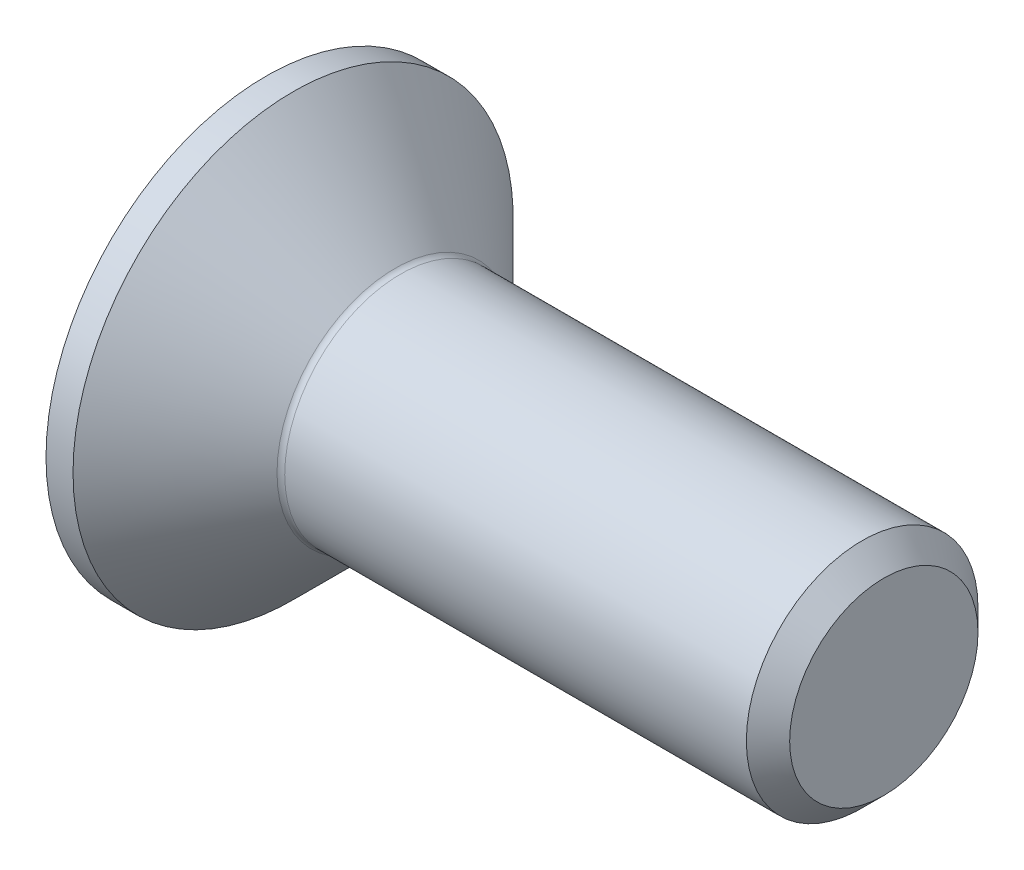
ISO-10303-21;
HEADER;
FILE_DESCRIPTION(('STEP AP214'),'2;1');
FILE_NAME('part.step','',(''),(''),'','','');
FILE_SCHEMA(('AUTOMOTIVE_DESIGN { 1 0 10303 214 1 1 1 1 }'));
ENDSEC;
DATA;
#1=APPLICATION_CONTEXT('core data for automotive mechanical design processes');
#2=APPLICATION_PROTOCOL_DEFINITION('international standard','automotive_design',2000,#1);
#3=PRODUCT_CONTEXT('',#1,'mechanical');
#4=PRODUCT('Part','Part','',(#3));
#5=PRODUCT_RELATED_PRODUCT_CATEGORY('part','',(#4));
#6=PRODUCT_DEFINITION_FORMATION('','',#4);
#7=PRODUCT_DEFINITION_CONTEXT('part definition',#1,'design');
#8=PRODUCT_DEFINITION('design','',#6,#7);
#9=PRODUCT_DEFINITION_SHAPE('','',#8);
#10=(LENGTH_UNIT() NAMED_UNIT(*) SI_UNIT(.MILLI.,.METRE.));
#11=(NAMED_UNIT(*) PLANE_ANGLE_UNIT() SI_UNIT($,.RADIAN.));
#12=(NAMED_UNIT(*) SI_UNIT($,.STERADIAN.) SOLID_ANGLE_UNIT());
#13=UNCERTAINTY_MEASURE_WITH_UNIT(LENGTH_MEASURE(1.E-05),#10,'distance_accuracy_value','');
#14=(GEOMETRIC_REPRESENTATION_CONTEXT(3) GLOBAL_UNCERTAINTY_ASSIGNED_CONTEXT((#13)) GLOBAL_UNIT_ASSIGNED_CONTEXT((#10,
#11,#12)) REPRESENTATION_CONTEXT('',''));
#15=CARTESIAN_POINT('',(0.,0.,0.));
#16=DIRECTION('',(0.,0.,1.));
#17=DIRECTION('',(1.,0.,0.));
#18=AXIS2_PLACEMENT_3D('',#15,#16,#17);
#19=CARTESIAN_POINT('',(0.,0.,0.));
#20=DIRECTION('',(-1.,0.,0.));
#21=DIRECTION('',(0.,0.,1.));
#22=AXIS2_PLACEMENT_3D('',#19,#20,#21);
#23=PLANE('',#22);
#24=CARTESIAN_POINT('',(0.,0.,0.));
#25=DIRECTION('',(-1.,0.,0.));
#26=DIRECTION('',(0.,0.,1.));
#27=AXIS2_PLACEMENT_3D('',#24,#25,#26);
#28=CIRCLE('',#27,2.85);
#29=CARTESIAN_POINT('',(0.,0.,2.85));
#30=VERTEX_POINT('',#29);
#31=EDGE_CURVE('E153',#30,#30,#28,.T.);
#32=ORIENTED_EDGE('',*,*,#31,.T.);
#33=EDGE_LOOP('',(#32));
#34=FACE_BOUND('',#33,.T.);
#35=DIRECTION('',(0.,-0.500000000000005,-0.866025403784435));
#36=VECTOR('',#35,1.);
#37=CARTESIAN_POINT('',(0.,-0.58312377188152,1.01));
#38=LINE('',#37,#36);
#39=CARTESIAN_POINT('',(0.,-0.58312377188152,1.01));
#40=VERTEX_POINT('',#39);
#41=CARTESIAN_POINT('',(0.,-1.16624754376305,0.));
#42=VERTEX_POINT('',#41);
#43=EDGE_CURVE('E115',#40,#42,#38,.T.);
#44=ORIENTED_EDGE('',*,*,#43,.T.);
#45=DIRECTION('',(0.,0.500000000000005,-0.866025403784436));
#46=VECTOR('',#45,1.);
#47=CARTESIAN_POINT('',(0.,-1.16624754376305,0.));
#48=LINE('',#47,#46);
#49=CARTESIAN_POINT('',(0.,-0.583123771881521,-1.01));
#50=VERTEX_POINT('',#49);
#51=EDGE_CURVE('E45',#42,#50,#48,.T.);
#52=ORIENTED_EDGE('',*,*,#51,.T.);
#53=DIRECTION('',(0.,1.,0.));
#54=VECTOR('',#53,1.);
#55=CARTESIAN_POINT('',(0.,-0.583123771881521,-1.01));
#56=LINE('',#55,#54);
#57=CARTESIAN_POINT('',(0.,0.583123771881522,-1.01));
#58=VERTEX_POINT('',#57);
#59=EDGE_CURVE('E130',#50,#58,#56,.T.);
#60=ORIENTED_EDGE('',*,*,#59,.T.);
#61=DIRECTION('',(0.,0.500000000000003,0.866025403784437));
#62=VECTOR('',#61,1.);
#63=CARTESIAN_POINT('',(0.,0.583123771881522,-1.01));
#64=LINE('',#63,#62);
#65=CARTESIAN_POINT('',(0.,1.16624754376305,0.));
#66=VERTEX_POINT('',#65);
#67=EDGE_CURVE('E266',#58,#66,#64,.T.);
#68=ORIENTED_EDGE('',*,*,#67,.T.);
#69=DIRECTION('',(0.,-0.500000000000001,0.866025403784438));
#70=VECTOR('',#69,1.);
#71=CARTESIAN_POINT('',(0.,1.16624754376305,0.));
#72=LINE('',#71,#70);
#73=CARTESIAN_POINT('',(0.,0.583123771881523,1.01));
#74=VERTEX_POINT('',#73);
#75=EDGE_CURVE('E269',#66,#74,#72,.T.);
#76=ORIENTED_EDGE('',*,*,#75,.T.);
#77=DIRECTION('',(0.,-1.,0.));
#78=VECTOR('',#77,1.);
#79=CARTESIAN_POINT('',(0.,0.583123771881523,1.01));
#80=LINE('',#79,#78);
#81=EDGE_CURVE('E272',#74,#40,#80,.T.);
#82=ORIENTED_EDGE('',*,*,#81,.T.);
#83=EDGE_LOOP('',(#44,#52,#60,#68,#76,#82));
#84=FACE_BOUND('',#83,.T.);
#85=ADVANCED_FACE('F30',(#34,#84),#23,.T.);
#86=CARTESIAN_POINT('',(0.,0.,0.));
#87=DIRECTION('',(-1.,0.,0.));
#88=DIRECTION('',(0.,0.,1.));
#89=AXIS2_PLACEMENT_3D('',#86,#87,#88);
#90=CYLINDRICAL_SURFACE('',#89,2.85);
#91=CARTESIAN_POINT('',(0.350000000000014,0.,0.));
#92=DIRECTION('',(-1.,0.,0.));
#93=DIRECTION('',(0.,0.,1.));
#94=AXIS2_PLACEMENT_3D('',#91,#92,#93);
#95=CIRCLE('',#94,2.85);
#96=CARTESIAN_POINT('',(0.350000000000014,0.,2.85));
#97=VERTEX_POINT('',#96);
#98=EDGE_CURVE('E150',#97,#97,#95,.T.);
#99=ORIENTED_EDGE('',*,*,#98,.T.);
#100=EDGE_LOOP('',(#99));
#101=FACE_BOUND('',#100,.T.);
#102=ORIENTED_EDGE('',*,*,#31,.F.);
#103=EDGE_LOOP('',(#102));
#104=FACE_BOUND('',#103,.T.);
#105=ADVANCED_FACE('F174',(#101,#104),#90,.T.);
#106=CARTESIAN_POINT('',(0.350000000000014,0.,0.));
#107=DIRECTION('',(-1.,0.,0.));
#108=DIRECTION('',(0.,0.,1.));
#109=AXIS2_PLACEMENT_3D('',#106,#107,#108);
#110=CONICAL_SURFACE('',#109,2.85,0.785398163397452);
#111=CARTESIAN_POINT('',(1.67071067811867,0.,0.));
#112=DIRECTION('',(-1.,0.,0.));
#113=DIRECTION('',(0.,0.,1.));
#114=AXIS2_PLACEMENT_3D('',#111,#112,#113);
#115=CIRCLE('',#114,1.52928932188134);
#116=CARTESIAN_POINT('',(1.67071067811867,0.,1.52928932188134));
#117=VERTEX_POINT('',#116);
#118=EDGE_CURVE('E38',#117,#117,#115,.T.);
#119=ORIENTED_EDGE('',*,*,#118,.T.);
#120=EDGE_LOOP('',(#119));
#121=FACE_BOUND('',#120,.T.);
#122=ORIENTED_EDGE('',*,*,#98,.F.);
#123=EDGE_LOOP('',(#122));
#124=FACE_BOUND('',#123,.T.);
#125=ADVANCED_FACE('F158',(#121,#124),#110,.T.);
#126=CARTESIAN_POINT('',(0.,0.,0.));
#127=DIRECTION('',(-1.,0.,0.));
#128=DIRECTION('',(0.,0.,1.));
#129=AXIS2_PLACEMENT_3D('',#126,#127,#128);
#130=CYLINDRICAL_SURFACE('',#129,1.49999999999999);
#131=CARTESIAN_POINT('',(1.74142135623732,0.,0.));
#132=DIRECTION('',(-1.,0.,0.));
#133=DIRECTION('',(0.,0.,1.));
#134=AXIS2_PLACEMENT_3D('',#131,#132,#133);
#135=CIRCLE('',#134,1.49999999999999);
#136=CARTESIAN_POINT('',(1.74142135623732,0.,1.49999999999999));
#137=VERTEX_POINT('',#136);
#138=EDGE_CURVE('E11',#137,#137,#135,.F.);
#139=ORIENTED_EDGE('',*,*,#138,.T.);
#140=EDGE_LOOP('',(#139));
#141=FACE_BOUND('',#140,.T.);
#142=CARTESIAN_POINT('',(7.71949999999998,0.,0.));
#143=DIRECTION('',(-1.,0.,0.));
#144=DIRECTION('',(0.,0.,1.));
#145=AXIS2_PLACEMENT_3D('',#142,#143,#144);
#146=CIRCLE('',#145,1.49999999999998);
#147=CARTESIAN_POINT('',(7.71949999999998,0.,1.49999999999998));
#148=VERTEX_POINT('',#147);
#149=EDGE_CURVE('E147',#148,#148,#146,.T.);
#150=ORIENTED_EDGE('',*,*,#149,.T.);
#151=EDGE_LOOP('',(#150));
#152=FACE_BOUND('',#151,.T.);
#153=ADVANCED_FACE('F185',(#141,#152),#130,.T.);
#154=CARTESIAN_POINT('',(8.,0.,0.));
#155=DIRECTION('',(-1.,0.,0.));
#156=DIRECTION('',(0.,0.,1.));
#157=AXIS2_PLACEMENT_3D('',#154,#155,#156);
#158=CONICAL_SURFACE('',#157,1.2195,0.785398163397371);
#159=ORIENTED_EDGE('',*,*,#149,.F.);
#160=EDGE_LOOP('',(#159));
#161=FACE_BOUND('',#160,.T.);
#162=CARTESIAN_POINT('',(8.,0.,0.));
#163=DIRECTION('',(-1.,0.,0.));
#164=DIRECTION('',(0.,0.,1.));
#165=AXIS2_PLACEMENT_3D('',#162,#163,#164);
#166=CIRCLE('',#165,1.2195);
#167=CARTESIAN_POINT('',(8.,0.,1.2195));
#168=VERTEX_POINT('',#167);
#169=EDGE_CURVE('E143',#168,#168,#166,.T.);
#170=ORIENTED_EDGE('',*,*,#169,.T.);
#171=EDGE_LOOP('',(#170));
#172=FACE_BOUND('',#171,.T.);
#173=ADVANCED_FACE('F169',(#161,#172),#158,.T.);
#174=CARTESIAN_POINT('',(8.,1.2195,0.));
#175=DIRECTION('',(1.,0.,0.));
#176=DIRECTION('',(0.,0.,-1.));
#177=AXIS2_PLACEMENT_3D('',#174,#175,#176);
#178=PLANE('',#177);
#179=ORIENTED_EDGE('',*,*,#169,.F.);
#180=EDGE_LOOP('',(#179));
#181=FACE_BOUND('',#180,.T.);
#182=ADVANCED_FACE('F162',(#181),#178,.T.);
#183=CARTESIAN_POINT('',(1.74142135623732,0.,0.));
#184=DIRECTION('',(-1.,0.,0.));
#185=DIRECTION('',(0.,0.,1.));
#186=AXIS2_PLACEMENT_3D('',#183,#184,#185);
#187=TOROIDAL_SURFACE('',#186,1.59999999999999,0.1);
#188=ORIENTED_EDGE('',*,*,#138,.F.);
#189=EDGE_LOOP('',(#188));
#190=FACE_BOUND('',#189,.T.);
#191=ORIENTED_EDGE('',*,*,#118,.F.);
#192=EDGE_LOOP('',(#191));
#193=FACE_BOUND('',#192,.T.);
#194=ADVANCED_FACE('F32',(#190,#193),#187,.F.);
#195=CARTESIAN_POINT('',(1.2,-1.16624754376305,0.));
#196=DIRECTION('',(0.,0.866025403784436,0.500000000000005));
#197=DIRECTION('',(0.,-0.500000000000005,0.866025403784436));
#198=AXIS2_PLACEMENT_3D('',#195,#196,#197);
#199=PLANE('',#198);
#200=ORIENTED_EDGE('',*,*,#51,.F.);
#201=DIRECTION('',(-1.,0.,0.));
#202=VECTOR('',#201,1.);
#203=CARTESIAN_POINT('',(1.2,-1.16624754376305,0.));
#204=LINE('',#203,#202);
#205=CARTESIAN_POINT('',(1.2,-1.16624754376305,0.));
#206=VERTEX_POINT('',#205);
#207=EDGE_CURVE('E263',#206,#42,#204,.T.);
#208=ORIENTED_EDGE('',*,*,#207,.F.);
#209=DIRECTION('',(0.,0.500000000000005,-0.866025403784436));
#210=VECTOR('',#209,1.);
#211=CARTESIAN_POINT('',(1.2,-1.16624754376305,0.));
#212=LINE('',#211,#210);
#213=CARTESIAN_POINT('',(1.2,-0.874685657822283,-0.505000000000006));
#214=VERTEX_POINT('',#213);
#215=EDGE_CURVE('E112',#206,#214,#212,.T.);
#216=ORIENTED_EDGE('',*,*,#215,.T.);
#217=CARTESIAN_POINT('',(1.2,-0.583123771881521,-1.01));
#218=VERTEX_POINT('',#217);
#219=EDGE_CURVE('E106',#214,#218,#212,.T.);
#220=ORIENTED_EDGE('',*,*,#219,.T.);
#221=DIRECTION('',(-1.,0.,0.));
#222=VECTOR('',#221,1.);
#223=CARTESIAN_POINT('',(1.2,-0.583123771881521,-1.01));
#224=LINE('',#223,#222);
#225=EDGE_CURVE('E110',#218,#50,#224,.T.);
#226=ORIENTED_EDGE('',*,*,#225,.T.);
#227=EDGE_LOOP('',(#200,#208,#216,#220,#226));
#228=FACE_BOUND('',#227,.T.);
#229=ADVANCED_FACE('F108',(#228),#199,.T.);
#230=CARTESIAN_POINT('',(1.2,-0.583123771881521,-1.01));
#231=DIRECTION('',(0.,0.,1.));
#232=DIRECTION('',(0.,-1.,0.));
#233=AXIS2_PLACEMENT_3D('',#230,#231,#232);
#234=PLANE('',#233);
#235=ORIENTED_EDGE('',*,*,#59,.F.);
#236=ORIENTED_EDGE('',*,*,#225,.F.);
#237=DIRECTION('',(0.,1.,0.));
#238=VECTOR('',#237,1.);
#239=CARTESIAN_POINT('',(1.2,-0.583123771881521,-1.01));
#240=LINE('',#239,#238);
#241=CARTESIAN_POINT('',(1.2,0.,-1.01));
#242=VERTEX_POINT('',#241);
#243=EDGE_CURVE('E118',#218,#242,#240,.T.);
#244=ORIENTED_EDGE('',*,*,#243,.T.);
#245=CARTESIAN_POINT('',(1.2,0.583123771881522,-1.01));
#246=VERTEX_POINT('',#245);
#247=EDGE_CURVE('E125',#242,#246,#240,.T.);
#248=ORIENTED_EDGE('',*,*,#247,.T.);
#249=DIRECTION('',(-1.,0.,0.));
#250=VECTOR('',#249,1.);
#251=CARTESIAN_POINT('',(1.2,0.583123771881522,-1.01));
#252=LINE('',#251,#250);
#253=EDGE_CURVE('E132',#246,#58,#252,.T.);
#254=ORIENTED_EDGE('',*,*,#253,.T.);
#255=EDGE_LOOP('',(#235,#236,#244,#248,#254));
#256=FACE_BOUND('',#255,.T.);
#257=ADVANCED_FACE('F127',(#256),#234,.T.);
#258=CARTESIAN_POINT('',(1.2,0.583123771881522,-1.01));
#259=DIRECTION('',(0.,-0.866025403784437,0.500000000000003));
#260=DIRECTION('',(0.,-0.500000000000003,-0.866025403784437));
#261=AXIS2_PLACEMENT_3D('',#258,#259,#260);
#262=PLANE('',#261);
#263=ORIENTED_EDGE('',*,*,#67,.F.);
#264=ORIENTED_EDGE('',*,*,#253,.F.);
#265=DIRECTION('',(0.,0.500000000000003,0.866025403784437));
#266=VECTOR('',#265,1.);
#267=CARTESIAN_POINT('',(1.2,0.583123771881522,-1.01));
#268=LINE('',#267,#266);
#269=CARTESIAN_POINT('',(1.2,0.874685657822282,-0.505000000000003));
#270=VERTEX_POINT('',#269);
#271=EDGE_CURVE('E255',#246,#270,#268,.T.);
#272=ORIENTED_EDGE('',*,*,#271,.T.);
#273=CARTESIAN_POINT('',(1.2,1.16624754376305,0.));
#274=VERTEX_POINT('',#273);
#275=EDGE_CURVE('E124',#270,#274,#268,.T.);
#276=ORIENTED_EDGE('',*,*,#275,.T.);
#277=DIRECTION('',(-1.,0.,0.));
#278=VECTOR('',#277,1.);
#279=CARTESIAN_POINT('',(1.2,1.16624754376305,0.));
#280=LINE('',#279,#278);
#281=EDGE_CURVE('E138',#274,#66,#280,.T.);
#282=ORIENTED_EDGE('',*,*,#281,.T.);
#283=EDGE_LOOP('',(#263,#264,#272,#276,#282));
#284=FACE_BOUND('',#283,.T.);
#285=ADVANCED_FACE('F199',(#284),#262,.T.);
#286=CARTESIAN_POINT('',(1.2,1.16624754376305,0.));
#287=DIRECTION('',(0.,-0.866025403784438,-0.500000000000001));
#288=DIRECTION('',(0.,0.500000000000001,-0.866025403784438));
#289=AXIS2_PLACEMENT_3D('',#286,#287,#288);
#290=PLANE('',#289);
#291=ORIENTED_EDGE('',*,*,#75,.F.);
#292=ORIENTED_EDGE('',*,*,#281,.F.);
#293=DIRECTION('',(0.,-0.500000000000001,0.866025403784438));
#294=VECTOR('',#293,1.);
#295=CARTESIAN_POINT('',(1.2,1.16624754376305,0.));
#296=LINE('',#295,#294);
#297=CARTESIAN_POINT('',(1.2,0.874685657822283,0.505000000000001));
#298=VERTEX_POINT('',#297);
#299=EDGE_CURVE('E53',#274,#298,#296,.T.);
#300=ORIENTED_EDGE('',*,*,#299,.T.);
#301=CARTESIAN_POINT('',(1.2,0.583123771881523,1.01));
#302=VERTEX_POINT('',#301);
#303=EDGE_CURVE('E234',#298,#302,#296,.T.);
#304=ORIENTED_EDGE('',*,*,#303,.T.);
#305=DIRECTION('',(-1.,0.,0.));
#306=VECTOR('',#305,1.);
#307=CARTESIAN_POINT('',(1.2,0.583123771881523,1.01));
#308=LINE('',#307,#306);
#309=EDGE_CURVE('E248',#302,#74,#308,.T.);
#310=ORIENTED_EDGE('',*,*,#309,.T.);
#311=EDGE_LOOP('',(#291,#292,#300,#304,#310));
#312=FACE_BOUND('',#311,.T.);
#313=ADVANCED_FACE('F202',(#312),#290,.T.);
#314=CARTESIAN_POINT('',(1.2,0.583123771881523,1.01));
#315=DIRECTION('',(0.,0.,-1.));
#316=DIRECTION('',(0.,1.,0.));
#317=AXIS2_PLACEMENT_3D('',#314,#315,#316);
#318=PLANE('',#317);
#319=ORIENTED_EDGE('',*,*,#81,.F.);
#320=ORIENTED_EDGE('',*,*,#309,.F.);
#321=DIRECTION('',(0.,-1.,0.));
#322=VECTOR('',#321,1.);
#323=CARTESIAN_POINT('',(1.2,0.583123771881523,1.01));
#324=LINE('',#323,#322);
#325=CARTESIAN_POINT('',(1.2,0.,1.01));
#326=VERTEX_POINT('',#325);
#327=EDGE_CURVE('E233',#302,#326,#324,.T.);
#328=ORIENTED_EDGE('',*,*,#327,.T.);
#329=CARTESIAN_POINT('',(1.2,-0.58312377188152,1.01));
#330=VERTEX_POINT('',#329);
#331=EDGE_CURVE('E239',#326,#330,#324,.T.);
#332=ORIENTED_EDGE('',*,*,#331,.T.);
#333=DIRECTION('',(-1.,0.,0.));
#334=VECTOR('',#333,1.);
#335=CARTESIAN_POINT('',(1.2,-0.58312377188152,1.01));
#336=LINE('',#335,#334);
#337=EDGE_CURVE('E278',#330,#40,#336,.T.);
#338=ORIENTED_EDGE('',*,*,#337,.T.);
#339=EDGE_LOOP('',(#319,#320,#328,#332,#338));
#340=FACE_BOUND('',#339,.T.);
#341=ADVANCED_FACE('F206',(#340),#318,.T.);
#342=CARTESIAN_POINT('',(1.2,-0.58312377188152,1.01));
#343=DIRECTION('',(0.,0.866025403784435,-0.500000000000005));
#344=DIRECTION('',(0.,0.500000000000005,0.866025403784436));
#345=AXIS2_PLACEMENT_3D('',#342,#343,#344);
#346=PLANE('',#345);
#347=ORIENTED_EDGE('',*,*,#43,.F.);
#348=ORIENTED_EDGE('',*,*,#337,.F.);
#349=DIRECTION('',(0.,-0.500000000000005,-0.866025403784435));
#350=VECTOR('',#349,1.);
#351=CARTESIAN_POINT('',(1.2,-0.58312377188152,1.01));
#352=LINE('',#351,#350);
#353=CARTESIAN_POINT('',(1.2,-0.874685657822282,0.505000000000007));
#354=VERTEX_POINT('',#353);
#355=EDGE_CURVE('E242',#330,#354,#352,.T.);
#356=ORIENTED_EDGE('',*,*,#355,.T.);
#357=EDGE_CURVE('E249',#354,#206,#352,.T.);
#358=ORIENTED_EDGE('',*,*,#357,.T.);
#359=ORIENTED_EDGE('',*,*,#207,.T.);
#360=EDGE_LOOP('',(#347,#348,#356,#358,#359));
#361=FACE_BOUND('',#360,.T.);
#362=ADVANCED_FACE('F209',(#361),#346,.T.);
#363=CARTESIAN_POINT('',(1.2,-1.16624754376305,0.));
#364=DIRECTION('',(-1.,0.,0.));
#365=DIRECTION('',(0.,0.,1.));
#366=AXIS2_PLACEMENT_3D('',#363,#364,#365);
#367=PLANE('',#366);
#368=CARTESIAN_POINT('',(1.2,0.,0.));
#369=DIRECTION('',(-1.,0.,0.));
#370=DIRECTION('',(0.,0.,1.));
#371=AXIS2_PLACEMENT_3D('',#368,#369,#370);
#372=CIRCLE('',#371,1.01);
#373=EDGE_CURVE('E131',#354,#326,#372,.T.);
#374=ORIENTED_EDGE('',*,*,#373,.F.);
#375=ORIENTED_EDGE('',*,*,#355,.F.);
#376=ORIENTED_EDGE('',*,*,#331,.F.);
#377=EDGE_LOOP('',(#374,#375,#376));
#378=FACE_BOUND('',#377,.T.);
#379=ADVANCED_FACE('F213',(#378),#367,.T.);
#380=EDGE_CURVE('E135',#214,#354,#372,.T.);
#381=ORIENTED_EDGE('',*,*,#380,.F.);
#382=ORIENTED_EDGE('',*,*,#215,.F.);
#383=ORIENTED_EDGE('',*,*,#357,.F.);
#384=EDGE_LOOP('',(#381,#382,#383));
#385=FACE_BOUND('',#384,.T.);
#386=ADVANCED_FACE('F216',(#385),#367,.T.);
#387=EDGE_CURVE('E120',#242,#214,#372,.T.);
#388=ORIENTED_EDGE('',*,*,#387,.F.);
#389=ORIENTED_EDGE('',*,*,#243,.F.);
#390=ORIENTED_EDGE('',*,*,#219,.F.);
#391=EDGE_LOOP('',(#388,#389,#390));
#392=FACE_BOUND('',#391,.T.);
#393=ADVANCED_FACE('F119',(#392),#367,.T.);
#394=EDGE_CURVE('E251',#270,#242,#372,.T.);
#395=ORIENTED_EDGE('',*,*,#394,.F.);
#396=ORIENTED_EDGE('',*,*,#271,.F.);
#397=ORIENTED_EDGE('',*,*,#247,.F.);
#398=EDGE_LOOP('',(#395,#396,#397));
#399=FACE_BOUND('',#398,.T.);
#400=ADVANCED_FACE('F228',(#399),#367,.T.);
#401=EDGE_CURVE('E144',#298,#270,#372,.T.);
#402=ORIENTED_EDGE('',*,*,#401,.F.);
#403=ORIENTED_EDGE('',*,*,#299,.F.);
#404=ORIENTED_EDGE('',*,*,#275,.F.);
#405=EDGE_LOOP('',(#402,#403,#404));
#406=FACE_BOUND('',#405,.T.);
#407=ADVANCED_FACE('F223',(#406),#367,.T.);
#408=EDGE_CURVE('E137',#326,#298,#372,.T.);
#409=ORIENTED_EDGE('',*,*,#408,.F.);
#410=ORIENTED_EDGE('',*,*,#327,.F.);
#411=ORIENTED_EDGE('',*,*,#303,.F.);
#412=EDGE_LOOP('',(#409,#410,#411));
#413=FACE_BOUND('',#412,.T.);
#414=ADVANCED_FACE('F194',(#413),#367,.T.);
#415=CARTESIAN_POINT('',(1.2,0.,0.));
#416=DIRECTION('',(-1.,0.,0.));
#417=DIRECTION('',(0.,0.,1.));
#418=AXIS2_PLACEMENT_3D('',#415,#416,#417);
#419=CONICAL_SURFACE('',#418,1.01,1.04719755119659);
#420=CARTESIAN_POINT('',(1.78312377188153,0.,0.));
#421=VERTEX_POINT('',#420);
#422=VERTEX_LOOP('',#421);
#423=FACE_BOUND('',#422,.T.);
#424=ORIENTED_EDGE('',*,*,#408,.T.);
#425=ORIENTED_EDGE('',*,*,#401,.T.);
#426=ORIENTED_EDGE('',*,*,#394,.T.);
#427=ORIENTED_EDGE('',*,*,#387,.T.);
#428=ORIENTED_EDGE('',*,*,#380,.T.);
#429=ORIENTED_EDGE('',*,*,#373,.T.);
#430=EDGE_LOOP('',(#424,#425,#426,#427,#428,#429));
#431=FACE_BOUND('',#430,.T.);
#432=ADVANCED_FACE('F192',(#423,#431),#419,.F.);
#433=CLOSED_SHELL('',(#85,#105,#125,#153,#173,#182,#194,#229,#257,#285,#313,#341,#362,#379,#386,
#393,#400,#407,#414,#432));
#434=MANIFOLD_SOLID_BREP('B2',#433);
#435=ADVANCED_BREP_SHAPE_REPRESENTATION('',(#18,#434),#14);
#436=SHAPE_DEFINITION_REPRESENTATION(#9,#435);
ENDSEC;
END-ISO-10303-21;
